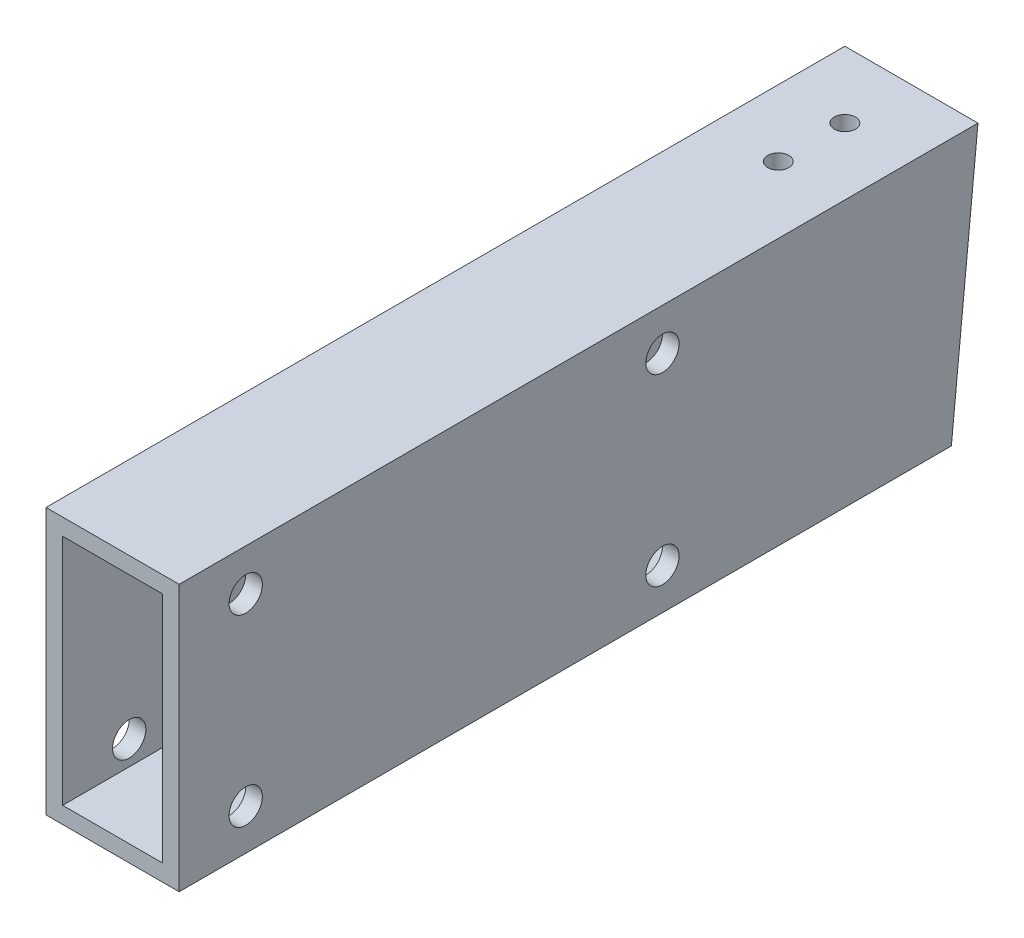
ISO-10303-21;
HEADER;
FILE_DESCRIPTION(('STEP AP214'),'2;1');
FILE_NAME('part.step','',(''),(''),'','','');
FILE_SCHEMA(('AUTOMOTIVE_DESIGN { 1 0 10303 214 1 1 1 1 }'));
ENDSEC;
DATA;
#1=APPLICATION_CONTEXT('core data for automotive mechanical design processes');
#2=APPLICATION_PROTOCOL_DEFINITION('international standard','automotive_design',2000,#1);
#3=PRODUCT_CONTEXT('',#1,'mechanical');
#4=PRODUCT('Part','Part','',(#3));
#5=PRODUCT_RELATED_PRODUCT_CATEGORY('part','',(#4));
#6=PRODUCT_DEFINITION_FORMATION('','',#4);
#7=PRODUCT_DEFINITION_CONTEXT('part definition',#1,'design');
#8=PRODUCT_DEFINITION('design','',#6,#7);
#9=PRODUCT_DEFINITION_SHAPE('','',#8);
#10=(LENGTH_UNIT() NAMED_UNIT(*) SI_UNIT(.MILLI.,.METRE.));
#11=(NAMED_UNIT(*) PLANE_ANGLE_UNIT() SI_UNIT($,.RADIAN.));
#12=(NAMED_UNIT(*) SI_UNIT($,.STERADIAN.) SOLID_ANGLE_UNIT());
#13=UNCERTAINTY_MEASURE_WITH_UNIT(LENGTH_MEASURE(1.E-05),#10,'distance_accuracy_value','');
#14=(GEOMETRIC_REPRESENTATION_CONTEXT(3) GLOBAL_UNCERTAINTY_ASSIGNED_CONTEXT((#13)) GLOBAL_UNIT_ASSIGNED_CONTEXT((#10,
#11,#12)) REPRESENTATION_CONTEXT('',''));
#15=CARTESIAN_POINT('',(0.,0.,0.));
#16=DIRECTION('',(0.,0.,1.));
#17=DIRECTION('',(1.,0.,0.));
#18=AXIS2_PLACEMENT_3D('',#15,#16,#17);
#19=CARTESIAN_POINT('',(12.7,-17.5895,63.4999999999996));
#20=DIRECTION('',(1.,0.,0.));
#21=DIRECTION('',(0.,0.,-1.));
#22=AXIS2_PLACEMENT_3D('',#19,#20,#21);
#23=CYLINDRICAL_SURFACE('',#22,3.175);
#24=CARTESIAN_POINT('',(-9.525,-17.5895,63.4999999999996));
#25=DIRECTION('',(-1.,0.,0.));
#26=DIRECTION('',(0.,-1.,0.));
#27=AXIS2_PLACEMENT_3D('',#24,#25,#26);
#28=CIRCLE('',#27,3.175);
#29=CARTESIAN_POINT('',(-9.525,-20.7645,63.4999999999996));
#30=VERTEX_POINT('',#29);
#31=EDGE_CURVE('E154',#30,#30,#28,.F.);
#32=ORIENTED_EDGE('',*,*,#31,.T.);
#33=EDGE_LOOP('',(#32));
#34=FACE_BOUND('',#33,.T.);
#35=CARTESIAN_POINT('',(-12.7,-17.5895,63.4999999999996));
#36=DIRECTION('',(1.,0.,0.));
#37=DIRECTION('',(0.,0.,-1.));
#38=AXIS2_PLACEMENT_3D('',#35,#36,#37);
#39=CIRCLE('',#38,3.17499999999999);
#40=CARTESIAN_POINT('',(-12.7,-17.5895,60.3249999999996));
#41=VERTEX_POINT('',#40);
#42=EDGE_CURVE('E192',#41,#41,#39,.T.);
#43=ORIENTED_EDGE('',*,*,#42,.F.);
#44=EDGE_LOOP('',(#43));
#45=FACE_BOUND('',#44,.T.);
#46=ADVANCED_FACE('F33',(#34,#45),#23,.F.);
#47=CARTESIAN_POINT('',(12.7,-17.5895,-16.0020000000004));
#48=DIRECTION('',(1.,0.,0.));
#49=DIRECTION('',(0.,0.,-1.));
#50=AXIS2_PLACEMENT_3D('',#47,#48,#49);
#51=CYLINDRICAL_SURFACE('',#50,3.175);
#52=CARTESIAN_POINT('',(-9.525,-17.5895,-16.0020000000004));
#53=DIRECTION('',(-1.,0.,0.));
#54=DIRECTION('',(0.,-1.,0.));
#55=AXIS2_PLACEMENT_3D('',#52,#53,#54);
#56=CIRCLE('',#55,3.175);
#57=CARTESIAN_POINT('',(-9.525,-20.7645,-16.0020000000004));
#58=VERTEX_POINT('',#57);
#59=EDGE_CURVE('E151',#58,#58,#56,.F.);
#60=ORIENTED_EDGE('',*,*,#59,.T.);
#61=EDGE_LOOP('',(#60));
#62=FACE_BOUND('',#61,.T.);
#63=CARTESIAN_POINT('',(-12.7,-17.5895,-16.0020000000004));
#64=DIRECTION('',(1.,0.,0.));
#65=DIRECTION('',(0.,0.,-1.));
#66=AXIS2_PLACEMENT_3D('',#63,#64,#65);
#67=CIRCLE('',#66,3.17499999999999);
#68=CARTESIAN_POINT('',(-12.7,-17.5895,-19.1770000000003));
#69=VERTEX_POINT('',#68);
#70=EDGE_CURVE('E186',#69,#69,#67,.T.);
#71=ORIENTED_EDGE('',*,*,#70,.F.);
#72=EDGE_LOOP('',(#71));
#73=FACE_BOUND('',#72,.T.);
#74=ADVANCED_FACE('F240',(#62,#73),#51,.F.);
#75=CARTESIAN_POINT('',(12.7,17.4625,-16.002));
#76=DIRECTION('',(1.,0.,0.));
#77=DIRECTION('',(0.,0.,-1.));
#78=AXIS2_PLACEMENT_3D('',#75,#76,#77);
#79=CYLINDRICAL_SURFACE('',#78,3.175);
#80=CARTESIAN_POINT('',(-9.52500000000001,17.4625,-16.002));
#81=DIRECTION('',(-1.,0.,0.));
#82=DIRECTION('',(0.,-1.,0.));
#83=AXIS2_PLACEMENT_3D('',#80,#81,#82);
#84=CIRCLE('',#83,3.175);
#85=CARTESIAN_POINT('',(-9.52500000000001,14.2875,-16.002));
#86=VERTEX_POINT('',#85);
#87=EDGE_CURVE('E148',#86,#86,#84,.F.);
#88=ORIENTED_EDGE('',*,*,#87,.T.);
#89=EDGE_LOOP('',(#88));
#90=FACE_BOUND('',#89,.T.);
#91=CARTESIAN_POINT('',(-12.7,17.4625,-16.002));
#92=DIRECTION('',(1.,0.,0.));
#93=DIRECTION('',(0.,0.,-1.));
#94=AXIS2_PLACEMENT_3D('',#91,#92,#93);
#95=CIRCLE('',#94,3.17499999999999);
#96=CARTESIAN_POINT('',(-12.7,17.4625,-19.177));
#97=VERTEX_POINT('',#96);
#98=EDGE_CURVE('E180',#97,#97,#95,.T.);
#99=ORIENTED_EDGE('',*,*,#98,.F.);
#100=EDGE_LOOP('',(#99));
#101=FACE_BOUND('',#100,.T.);
#102=ADVANCED_FACE('F308',(#90,#101),#79,.F.);
#103=CARTESIAN_POINT('',(12.7,17.4625,63.5));
#104=DIRECTION('',(1.,0.,0.));
#105=DIRECTION('',(0.,0.,-1.));
#106=AXIS2_PLACEMENT_3D('',#103,#104,#105);
#107=CYLINDRICAL_SURFACE('',#106,3.175);
#108=CARTESIAN_POINT('',(-9.52500000000001,17.4625,63.5));
#109=DIRECTION('',(-1.,0.,0.));
#110=DIRECTION('',(0.,-1.,0.));
#111=AXIS2_PLACEMENT_3D('',#108,#109,#110);
#112=CIRCLE('',#111,3.175);
#113=CARTESIAN_POINT('',(-9.52500000000001,14.2875,63.5));
#114=VERTEX_POINT('',#113);
#115=EDGE_CURVE('E145',#114,#114,#112,.F.);
#116=ORIENTED_EDGE('',*,*,#115,.T.);
#117=EDGE_LOOP('',(#116));
#118=FACE_BOUND('',#117,.T.);
#119=CARTESIAN_POINT('',(-12.7,17.4625,63.5));
#120=DIRECTION('',(1.,0.,0.));
#121=DIRECTION('',(0.,0.,-1.));
#122=AXIS2_PLACEMENT_3D('',#119,#120,#121);
#123=CIRCLE('',#122,3.17499999999999);
#124=CARTESIAN_POINT('',(-12.7,17.4625,60.325));
#125=VERTEX_POINT('',#124);
#126=EDGE_CURVE('E174',#125,#125,#123,.T.);
#127=ORIENTED_EDGE('',*,*,#126,.F.);
#128=EDGE_LOOP('',(#127));
#129=FACE_BOUND('',#128,.T.);
#130=ADVANCED_FACE('F248',(#118,#129),#107,.F.);
#131=CARTESIAN_POINT('',(-12.7,25.4,76.2));
#132=DIRECTION('',(1.,0.,0.));
#133=DIRECTION('',(0.,1.,0.));
#134=AXIS2_PLACEMENT_3D('',#131,#132,#133);
#135=PLANE('',#134);
#136=ORIENTED_EDGE('',*,*,#126,.T.);
#137=EDGE_LOOP('',(#136));
#138=FACE_BOUND('',#137,.T.);
#139=ORIENTED_EDGE('',*,*,#98,.T.);
#140=EDGE_LOOP('',(#139));
#141=FACE_BOUND('',#140,.T.);
#142=ORIENTED_EDGE('',*,*,#70,.T.);
#143=EDGE_LOOP('',(#142));
#144=FACE_BOUND('',#143,.T.);
#145=ORIENTED_EDGE('',*,*,#42,.T.);
#146=EDGE_LOOP('',(#145));
#147=FACE_BOUND('',#146,.T.);
#148=DIRECTION('',(0.,0.,-1.));
#149=VECTOR('',#148,1.);
#150=CARTESIAN_POINT('',(-12.7,25.4,76.2));
#151=LINE('',#150,#149);
#152=CARTESIAN_POINT('',(-12.7,25.4,76.2));
#153=VERTEX_POINT('',#152);
#154=CARTESIAN_POINT('',(-12.7,25.4,-76.2));
#155=VERTEX_POINT('',#154);
#156=EDGE_CURVE('E205',#153,#155,#151,.T.);
#157=ORIENTED_EDGE('',*,*,#156,.T.);
#158=DIRECTION('',(0.,-0.995037190209989,0.0995037190209989));
#159=VECTOR('',#158,1.);
#160=CARTESIAN_POINT('',(-12.7,25.4,-76.2));
#161=LINE('',#160,#159);
#162=CARTESIAN_POINT('',(-12.7,-25.4,-71.12));
#163=VERTEX_POINT('',#162);
#164=EDGE_CURVE('E158',#155,#163,#161,.T.);
#165=ORIENTED_EDGE('',*,*,#164,.T.);
#166=DIRECTION('',(0.,0.,-1.));
#167=VECTOR('',#166,1.);
#168=CARTESIAN_POINT('',(-12.7,-25.4,76.2));
#169=LINE('',#168,#167);
#170=CARTESIAN_POINT('',(-12.7,-25.4,76.2));
#171=VERTEX_POINT('',#170);
#172=EDGE_CURVE('E216',#171,#163,#169,.T.);
#173=ORIENTED_EDGE('',*,*,#172,.F.);
#174=DIRECTION('',(0.,-1.,0.));
#175=VECTOR('',#174,1.);
#176=CARTESIAN_POINT('',(-12.7,25.4,76.2));
#177=LINE('',#176,#175);
#178=EDGE_CURVE('E196',#153,#171,#177,.T.);
#179=ORIENTED_EDGE('',*,*,#178,.F.);
#180=EDGE_LOOP('',(#157,#165,#173,#179));
#181=FACE_BOUND('',#180,.T.);
#182=ADVANCED_FACE('F35',(#138,#141,#144,#147,#181),#135,.F.);
#183=CARTESIAN_POINT('',(12.7,-25.4,76.2));
#184=DIRECTION('',(0.,1.,0.));
#185=DIRECTION('',(-1.,0.,0.));
#186=AXIS2_PLACEMENT_3D('',#183,#184,#185);
#187=PLANE('',#186);
#188=ORIENTED_EDGE('',*,*,#172,.T.);
#189=DIRECTION('',(1.,0.,0.));
#190=VECTOR('',#189,1.);
#191=CARTESIAN_POINT('',(-12.7,-25.4,-71.12));
#192=LINE('',#191,#190);
#193=CARTESIAN_POINT('',(12.7,-25.4,-71.12));
#194=VERTEX_POINT('',#193);
#195=EDGE_CURVE('E161',#163,#194,#192,.T.);
#196=ORIENTED_EDGE('',*,*,#195,.T.);
#197=DIRECTION('',(0.,0.,-1.));
#198=VECTOR('',#197,1.);
#199=CARTESIAN_POINT('',(12.7,-25.4,76.2));
#200=LINE('',#199,#198);
#201=CARTESIAN_POINT('',(12.7,-25.4,76.2));
#202=VERTEX_POINT('',#201);
#203=EDGE_CURVE('E213',#202,#194,#200,.T.);
#204=ORIENTED_EDGE('',*,*,#203,.F.);
#205=DIRECTION('',(1.,0.,0.));
#206=VECTOR('',#205,1.);
#207=CARTESIAN_POINT('',(12.7,-25.4,76.2));
#208=LINE('',#207,#206);
#209=EDGE_CURVE('E199',#171,#202,#208,.T.);
#210=ORIENTED_EDGE('',*,*,#209,.F.);
#211=EDGE_LOOP('',(#188,#196,#204,#210));
#212=FACE_BOUND('',#211,.T.);
#213=ADVANCED_FACE('F247',(#212),#187,.F.);
#214=CARTESIAN_POINT('',(12.7,25.4,76.2));
#215=DIRECTION('',(-1.,0.,0.));
#216=DIRECTION('',(0.,-1.,0.));
#217=AXIS2_PLACEMENT_3D('',#214,#215,#216);
#218=PLANE('',#217);
#219=CARTESIAN_POINT('',(12.7,17.4625,63.5));
#220=DIRECTION('',(1.,0.,0.));
#221=DIRECTION('',(0.,0.,-1.));
#222=AXIS2_PLACEMENT_3D('',#219,#220,#221);
#223=CIRCLE('',#222,3.175);
#224=CARTESIAN_POINT('',(12.7,17.4625,60.325));
#225=VERTEX_POINT('',#224);
#226=EDGE_CURVE('E171',#225,#225,#223,.T.);
#227=ORIENTED_EDGE('',*,*,#226,.F.);
#228=EDGE_LOOP('',(#227));
#229=FACE_BOUND('',#228,.T.);
#230=CARTESIAN_POINT('',(12.7,17.4625,-16.002));
#231=DIRECTION('',(1.,0.,0.));
#232=DIRECTION('',(0.,0.,-1.));
#233=AXIS2_PLACEMENT_3D('',#230,#231,#232);
#234=CIRCLE('',#233,3.175);
#235=CARTESIAN_POINT('',(12.7,17.4625,-19.177));
#236=VERTEX_POINT('',#235);
#237=EDGE_CURVE('E177',#236,#236,#234,.T.);
#238=ORIENTED_EDGE('',*,*,#237,.F.);
#239=EDGE_LOOP('',(#238));
#240=FACE_BOUND('',#239,.T.);
#241=CARTESIAN_POINT('',(12.7,-17.5895,-16.0020000000004));
#242=DIRECTION('',(1.,0.,0.));
#243=DIRECTION('',(0.,0.,-1.));
#244=AXIS2_PLACEMENT_3D('',#241,#242,#243);
#245=CIRCLE('',#244,3.175);
#246=CARTESIAN_POINT('',(12.7,-17.5895,-19.1770000000003));
#247=VERTEX_POINT('',#246);
#248=EDGE_CURVE('E183',#247,#247,#245,.T.);
#249=ORIENTED_EDGE('',*,*,#248,.F.);
#250=EDGE_LOOP('',(#249));
#251=FACE_BOUND('',#250,.T.);
#252=CARTESIAN_POINT('',(12.7,-17.5895,63.4999999999996));
#253=DIRECTION('',(1.,0.,0.));
#254=DIRECTION('',(0.,0.,-1.));
#255=AXIS2_PLACEMENT_3D('',#252,#253,#254);
#256=CIRCLE('',#255,3.175);
#257=CARTESIAN_POINT('',(12.7,-17.5895,60.3249999999996));
#258=VERTEX_POINT('',#257);
#259=EDGE_CURVE('E189',#258,#258,#256,.T.);
#260=ORIENTED_EDGE('',*,*,#259,.F.);
#261=EDGE_LOOP('',(#260));
#262=FACE_BOUND('',#261,.T.);
#263=ORIENTED_EDGE('',*,*,#203,.T.);
#264=DIRECTION('',(0.,-0.995037190209989,0.0995037190209989));
#265=VECTOR('',#264,1.);
#266=CARTESIAN_POINT('',(12.7,25.4,-76.2));
#267=LINE('',#266,#265);
#268=CARTESIAN_POINT('',(12.7,25.4,-76.2));
#269=VERTEX_POINT('',#268);
#270=EDGE_CURVE('E157',#269,#194,#267,.T.);
#271=ORIENTED_EDGE('',*,*,#270,.F.);
#272=DIRECTION('',(0.,0.,-1.));
#273=VECTOR('',#272,1.);
#274=CARTESIAN_POINT('',(12.7,25.4,76.2));
#275=LINE('',#274,#273);
#276=CARTESIAN_POINT('',(12.7,25.4,76.2));
#277=VERTEX_POINT('',#276);
#278=EDGE_CURVE('E210',#277,#269,#275,.T.);
#279=ORIENTED_EDGE('',*,*,#278,.F.);
#280=DIRECTION('',(0.,1.,0.));
#281=VECTOR('',#280,1.);
#282=CARTESIAN_POINT('',(12.7,25.4,76.2));
#283=LINE('',#282,#281);
#284=EDGE_CURVE('E201',#202,#277,#283,.T.);
#285=ORIENTED_EDGE('',*,*,#284,.F.);
#286=EDGE_LOOP('',(#263,#271,#279,#285));
#287=FACE_BOUND('',#286,.T.);
#288=ADVANCED_FACE('F259',(#229,#240,#251,#262,#287),#218,.F.);
#289=CARTESIAN_POINT('',(12.7,25.4,76.2));
#290=DIRECTION('',(0.,-1.,0.));
#291=DIRECTION('',(1.,0.,0.));
#292=AXIS2_PLACEMENT_3D('',#289,#290,#291);
#293=PLANE('',#292);
#294=CARTESIAN_POINT('',(-1.40512601554121E-13,25.4,-63.5));
#295=DIRECTION('',(0.,1.,0.));
#296=DIRECTION('',(0.,0.,1.));
#297=AXIS2_PLACEMENT_3D('',#294,#295,#296);
#298=CIRCLE('',#297,2.01929999999999);
#299=CARTESIAN_POINT('',(-1.40512601554121E-13,25.4,-61.4807));
#300=VERTEX_POINT('',#299);
#301=EDGE_CURVE('E165',#300,#300,#298,.T.);
#302=ORIENTED_EDGE('',*,*,#301,.F.);
#303=EDGE_LOOP('',(#302));
#304=FACE_BOUND('',#303,.T.);
#305=CARTESIAN_POINT('',(0.,25.4,-50.8));
#306=DIRECTION('',(0.,1.,0.));
#307=DIRECTION('',(0.,0.,1.));
#308=AXIS2_PLACEMENT_3D('',#305,#306,#307);
#309=CIRCLE('',#308,2.01929999999999);
#310=CARTESIAN_POINT('',(0.,25.4,-48.7807));
#311=VERTEX_POINT('',#310);
#312=EDGE_CURVE('E168',#311,#311,#309,.T.);
#313=ORIENTED_EDGE('',*,*,#312,.F.);
#314=EDGE_LOOP('',(#313));
#315=FACE_BOUND('',#314,.T.);
#316=DIRECTION('',(-1.,0.,0.));
#317=VECTOR('',#316,1.);
#318=CARTESIAN_POINT('',(12.7,25.4,-76.2));
#319=LINE('',#318,#317);
#320=EDGE_CURVE('E195',#269,#155,#319,.T.);
#321=ORIENTED_EDGE('',*,*,#320,.T.);
#322=ORIENTED_EDGE('',*,*,#156,.F.);
#323=DIRECTION('',(-1.,0.,0.));
#324=VECTOR('',#323,1.);
#325=CARTESIAN_POINT('',(12.7,25.4,76.2));
#326=LINE('',#325,#324);
#327=EDGE_CURVE('E203',#277,#153,#326,.T.);
#328=ORIENTED_EDGE('',*,*,#327,.F.);
#329=ORIENTED_EDGE('',*,*,#278,.T.);
#330=EDGE_LOOP('',(#321,#322,#328,#329));
#331=FACE_BOUND('',#330,.T.);
#332=ADVANCED_FACE('F255',(#304,#315,#331),#293,.F.);
#333=CARTESIAN_POINT('',(0.,0.,76.2));
#334=DIRECTION('',(0.,0.,-1.));
#335=DIRECTION('',(-1.,0.,0.));
#336=AXIS2_PLACEMENT_3D('',#333,#334,#335);
#337=PLANE('',#336);
#338=DIRECTION('',(1.,0.,0.));
#339=VECTOR('',#338,1.);
#340=CARTESIAN_POINT('',(-9.525,-22.225,76.2));
#341=LINE('',#340,#339);
#342=CARTESIAN_POINT('',(-9.525,-22.225,76.2));
#343=VERTEX_POINT('',#342);
#344=CARTESIAN_POINT('',(9.525,-22.225,76.2));
#345=VERTEX_POINT('',#344);
#346=EDGE_CURVE('E111',#343,#345,#341,.T.);
#347=ORIENTED_EDGE('',*,*,#346,.F.);
#348=DIRECTION('',(0.,-1.,0.));
#349=VECTOR('',#348,1.);
#350=CARTESIAN_POINT('',(-9.52500000000001,22.225,76.2));
#351=LINE('',#350,#349);
#352=CARTESIAN_POINT('',(-9.52500000000001,22.225,76.2));
#353=VERTEX_POINT('',#352);
#354=EDGE_CURVE('E48',#353,#343,#351,.T.);
#355=ORIENTED_EDGE('',*,*,#354,.F.);
#356=DIRECTION('',(-1.,0.,0.));
#357=VECTOR('',#356,1.);
#358=CARTESIAN_POINT('',(9.52499999999999,22.225,76.2));
#359=LINE('',#358,#357);
#360=CARTESIAN_POINT('',(9.52499999999999,22.225,76.2));
#361=VERTEX_POINT('',#360);
#362=EDGE_CURVE('E118',#361,#353,#359,.T.);
#363=ORIENTED_EDGE('',*,*,#362,.F.);
#364=DIRECTION('',(0.,1.,0.));
#365=VECTOR('',#364,1.);
#366=CARTESIAN_POINT('',(9.525,-22.225,76.2));
#367=LINE('',#366,#365);
#368=EDGE_CURVE('E102',#345,#361,#367,.T.);
#369=ORIENTED_EDGE('',*,*,#368,.F.);
#370=EDGE_LOOP('',(#347,#355,#363,#369));
#371=FACE_BOUND('',#370,.T.);
#372=ORIENTED_EDGE('',*,*,#178,.T.);
#373=ORIENTED_EDGE('',*,*,#209,.T.);
#374=ORIENTED_EDGE('',*,*,#284,.T.);
#375=ORIENTED_EDGE('',*,*,#327,.T.);
#376=EDGE_LOOP('',(#372,#373,#374,#375));
#377=FACE_BOUND('',#376,.T.);
#378=ADVANCED_FACE('F115',(#371,#377),#337,.F.);
#379=CARTESIAN_POINT('',(9.525,-17.5895,63.4999999999996));
#380=DIRECTION('',(1.,0.,0.));
#381=DIRECTION('',(0.,1.,0.));
#382=AXIS2_PLACEMENT_3D('',#379,#380,#381);
#383=CIRCLE('',#382,3.175);
#384=CARTESIAN_POINT('',(9.525,-14.4145,63.4999999999996));
#385=VERTEX_POINT('',#384);
#386=EDGE_CURVE('E136',#385,#385,#383,.F.);
#387=ORIENTED_EDGE('',*,*,#386,.T.);
#388=EDGE_LOOP('',(#387));
#389=FACE_BOUND('',#388,.T.);
#390=ORIENTED_EDGE('',*,*,#259,.T.);
#391=EDGE_LOOP('',(#390));
#392=FACE_BOUND('',#391,.T.);
#393=ADVANCED_FACE('F242',(#389,#392),#23,.F.);
#394=CARTESIAN_POINT('',(9.525,-17.5895,-16.0020000000004));
#395=DIRECTION('',(1.,0.,0.));
#396=DIRECTION('',(0.,1.,0.));
#397=AXIS2_PLACEMENT_3D('',#394,#395,#396);
#398=CIRCLE('',#397,3.175);
#399=CARTESIAN_POINT('',(9.525,-14.4145,-16.0020000000004));
#400=VERTEX_POINT('',#399);
#401=EDGE_CURVE('E133',#400,#400,#398,.F.);
#402=ORIENTED_EDGE('',*,*,#401,.T.);
#403=EDGE_LOOP('',(#402));
#404=FACE_BOUND('',#403,.T.);
#405=ORIENTED_EDGE('',*,*,#248,.T.);
#406=EDGE_LOOP('',(#405));
#407=FACE_BOUND('',#406,.T.);
#408=ADVANCED_FACE('F269',(#404,#407),#51,.F.);
#409=CARTESIAN_POINT('',(9.52499999999999,17.4625,-16.002));
#410=DIRECTION('',(1.,0.,0.));
#411=DIRECTION('',(0.,1.,0.));
#412=AXIS2_PLACEMENT_3D('',#409,#410,#411);
#413=CIRCLE('',#412,3.175);
#414=CARTESIAN_POINT('',(9.52499999999999,20.6375,-16.002));
#415=VERTEX_POINT('',#414);
#416=EDGE_CURVE('E130',#415,#415,#413,.F.);
#417=ORIENTED_EDGE('',*,*,#416,.T.);
#418=EDGE_LOOP('',(#417));
#419=FACE_BOUND('',#418,.T.);
#420=ORIENTED_EDGE('',*,*,#237,.T.);
#421=EDGE_LOOP('',(#420));
#422=FACE_BOUND('',#421,.T.);
#423=ADVANCED_FACE('F319',(#419,#422),#79,.F.);
#424=CARTESIAN_POINT('',(9.52499999999999,17.4625,63.5));
#425=DIRECTION('',(1.,0.,0.));
#426=DIRECTION('',(0.,1.,0.));
#427=AXIS2_PLACEMENT_3D('',#424,#425,#426);
#428=CIRCLE('',#427,3.175);
#429=CARTESIAN_POINT('',(9.52499999999999,20.6375,63.5));
#430=VERTEX_POINT('',#429);
#431=EDGE_CURVE('E125',#430,#430,#428,.F.);
#432=ORIENTED_EDGE('',*,*,#431,.T.);
#433=EDGE_LOOP('',(#432));
#434=FACE_BOUND('',#433,.T.);
#435=ORIENTED_EDGE('',*,*,#226,.T.);
#436=EDGE_LOOP('',(#435));
#437=FACE_BOUND('',#436,.T.);
#438=ADVANCED_FACE('F327',(#434,#437),#107,.F.);
#439=CARTESIAN_POINT('',(0.,25.4,-50.8));
#440=DIRECTION('',(0.,1.,0.));
#441=DIRECTION('',(0.,0.,1.));
#442=AXIS2_PLACEMENT_3D('',#439,#440,#441);
#443=CYLINDRICAL_SURFACE('',#442,2.01929999999999);
#444=CARTESIAN_POINT('',(0.,22.225,-50.8));
#445=DIRECTION('',(0.,1.,0.));
#446=DIRECTION('',(-1.,0.,0.));
#447=AXIS2_PLACEMENT_3D('',#444,#445,#446);
#448=CIRCLE('',#447,2.01929999999999);
#449=CARTESIAN_POINT('',(-2.0193,22.225,-50.8));
#450=VERTEX_POINT('',#449);
#451=EDGE_CURVE('E142',#450,#450,#448,.F.);
#452=ORIENTED_EDGE('',*,*,#451,.T.);
#453=EDGE_LOOP('',(#452));
#454=FACE_BOUND('',#453,.T.);
#455=ORIENTED_EDGE('',*,*,#312,.T.);
#456=EDGE_LOOP('',(#455));
#457=FACE_BOUND('',#456,.T.);
#458=ADVANCED_FACE('F362',(#454,#457),#443,.F.);
#459=CARTESIAN_POINT('',(-1.40512601554121E-13,25.4,-63.5));
#460=DIRECTION('',(0.,1.,0.));
#461=DIRECTION('',(0.,0.,1.));
#462=AXIS2_PLACEMENT_3D('',#459,#460,#461);
#463=CYLINDRICAL_SURFACE('',#462,2.01929999999999);
#464=CARTESIAN_POINT('',(-1.40512601554121E-13,22.225,-63.5));
#465=DIRECTION('',(0.,1.,0.));
#466=DIRECTION('',(-1.,0.,0.));
#467=AXIS2_PLACEMENT_3D('',#464,#465,#466);
#468=CIRCLE('',#467,2.01929999999999);
#469=CARTESIAN_POINT('',(-2.01930000000013,22.225,-63.5));
#470=VERTEX_POINT('',#469);
#471=EDGE_CURVE('E139',#470,#470,#468,.F.);
#472=ORIENTED_EDGE('',*,*,#471,.T.);
#473=EDGE_LOOP('',(#472));
#474=FACE_BOUND('',#473,.T.);
#475=ORIENTED_EDGE('',*,*,#301,.T.);
#476=EDGE_LOOP('',(#475));
#477=FACE_BOUND('',#476,.T.);
#478=ADVANCED_FACE('F371',(#474,#477),#463,.F.);
#479=CARTESIAN_POINT('',(-12.7,25.4,-76.2));
#480=DIRECTION('',(0.,0.099503719020999,0.995037190209989));
#481=DIRECTION('',(0.,-0.995037190209989,0.099503719020999));
#482=AXIS2_PLACEMENT_3D('',#479,#480,#481);
#483=PLANE('',#482);
#484=DIRECTION('',(-1.,0.,0.));
#485=VECTOR('',#484,1.);
#486=CARTESIAN_POINT('',(-12.7,22.225,-75.8825));
#487=LINE('',#486,#485);
#488=CARTESIAN_POINT('',(9.52499999999999,22.225,-75.8825));
#489=VERTEX_POINT('',#488);
#490=CARTESIAN_POINT('',(-9.52500000000001,22.225,-75.8825));
#491=VERTEX_POINT('',#490);
#492=EDGE_CURVE('E41',#489,#491,#487,.T.);
#493=ORIENTED_EDGE('',*,*,#492,.T.);
#494=DIRECTION('',(0.,-0.995037190209989,0.0995037190209989));
#495=VECTOR('',#494,1.);
#496=CARTESIAN_POINT('',(-9.52500000000001,25.4,-76.2));
#497=LINE('',#496,#495);
#498=CARTESIAN_POINT('',(-9.525,-22.225,-71.4375));
#499=VERTEX_POINT('',#498);
#500=EDGE_CURVE('E11',#491,#499,#497,.T.);
#501=ORIENTED_EDGE('',*,*,#500,.T.);
#502=DIRECTION('',(1.,0.,0.));
#503=VECTOR('',#502,1.);
#504=CARTESIAN_POINT('',(-12.7,-22.225,-71.4375));
#505=LINE('',#504,#503);
#506=CARTESIAN_POINT('',(9.525,-22.225,-71.4375));
#507=VERTEX_POINT('',#506);
#508=EDGE_CURVE('E219',#499,#507,#505,.T.);
#509=ORIENTED_EDGE('',*,*,#508,.T.);
#510=DIRECTION('',(0.,0.995037190209989,-0.0995037190209989));
#511=VECTOR('',#510,1.);
#512=CARTESIAN_POINT('',(9.52499999999999,25.4,-76.2));
#513=LINE('',#512,#511);
#514=EDGE_CURVE('E105',#507,#489,#513,.T.);
#515=ORIENTED_EDGE('',*,*,#514,.T.);
#516=EDGE_LOOP('',(#493,#501,#509,#515));
#517=FACE_BOUND('',#516,.T.);
#518=ORIENTED_EDGE('',*,*,#270,.T.);
#519=ORIENTED_EDGE('',*,*,#195,.F.);
#520=ORIENTED_EDGE('',*,*,#164,.F.);
#521=ORIENTED_EDGE('',*,*,#320,.F.);
#522=EDGE_LOOP('',(#518,#519,#520,#521));
#523=FACE_BOUND('',#522,.T.);
#524=ADVANCED_FACE('F223',(#517,#523),#483,.F.);
#525=CARTESIAN_POINT('',(-9.52500000000001,22.225,-76.2));
#526=DIRECTION('',(-1.,0.,0.));
#527=DIRECTION('',(0.,-1.,0.));
#528=AXIS2_PLACEMENT_3D('',#525,#526,#527);
#529=PLANE('',#528);
#530=ORIENTED_EDGE('',*,*,#59,.F.);
#531=EDGE_LOOP('',(#530));
#532=FACE_BOUND('',#531,.T.);
#533=ORIENTED_EDGE('',*,*,#115,.F.);
#534=EDGE_LOOP('',(#533));
#535=FACE_BOUND('',#534,.T.);
#536=DIRECTION('',(0.,0.,1.));
#537=VECTOR('',#536,1.);
#538=CARTESIAN_POINT('',(-9.52500000000001,22.225,-76.2));
#539=LINE('',#538,#537);
#540=EDGE_CURVE('E123',#491,#353,#539,.T.);
#541=ORIENTED_EDGE('',*,*,#540,.T.);
#542=ORIENTED_EDGE('',*,*,#354,.T.);
#543=DIRECTION('',(0.,0.,1.));
#544=VECTOR('',#543,1.);
#545=CARTESIAN_POINT('',(-9.525,-22.225,-76.2));
#546=LINE('',#545,#544);
#547=EDGE_CURVE('E108',#499,#343,#546,.T.);
#548=ORIENTED_EDGE('',*,*,#547,.F.);
#549=ORIENTED_EDGE('',*,*,#500,.F.);
#550=EDGE_LOOP('',(#541,#542,#548,#549));
#551=FACE_BOUND('',#550,.T.);
#552=ORIENTED_EDGE('',*,*,#87,.F.);
#553=EDGE_LOOP('',(#552));
#554=FACE_BOUND('',#553,.T.);
#555=ORIENTED_EDGE('',*,*,#31,.F.);
#556=EDGE_LOOP('',(#555));
#557=FACE_BOUND('',#556,.T.);
#558=ADVANCED_FACE('F229',(#532,#535,#551,#554,#557),#529,.F.);
#559=CARTESIAN_POINT('',(9.52499999999999,22.225,-76.2));
#560=DIRECTION('',(0.,1.,0.));
#561=DIRECTION('',(-1.,0.,0.));
#562=AXIS2_PLACEMENT_3D('',#559,#560,#561);
#563=PLANE('',#562);
#564=ORIENTED_EDGE('',*,*,#471,.F.);
#565=EDGE_LOOP('',(#564));
#566=FACE_BOUND('',#565,.T.);
#567=DIRECTION('',(0.,0.,1.));
#568=VECTOR('',#567,1.);
#569=CARTESIAN_POINT('',(9.52499999999999,22.225,-76.2));
#570=LINE('',#569,#568);
#571=EDGE_CURVE('E107',#489,#361,#570,.T.);
#572=ORIENTED_EDGE('',*,*,#571,.T.);
#573=ORIENTED_EDGE('',*,*,#362,.T.);
#574=ORIENTED_EDGE('',*,*,#540,.F.);
#575=ORIENTED_EDGE('',*,*,#492,.F.);
#576=EDGE_LOOP('',(#572,#573,#574,#575));
#577=FACE_BOUND('',#576,.T.);
#578=ORIENTED_EDGE('',*,*,#451,.F.);
#579=EDGE_LOOP('',(#578));
#580=FACE_BOUND('',#579,.T.);
#581=ADVANCED_FACE('F227',(#566,#577,#580),#563,.F.);
#582=CARTESIAN_POINT('',(9.525,-22.225,-76.2));
#583=DIRECTION('',(1.,0.,0.));
#584=DIRECTION('',(0.,1.,0.));
#585=AXIS2_PLACEMENT_3D('',#582,#583,#584);
#586=PLANE('',#585);
#587=ORIENTED_EDGE('',*,*,#401,.F.);
#588=EDGE_LOOP('',(#587));
#589=FACE_BOUND('',#588,.T.);
#590=ORIENTED_EDGE('',*,*,#431,.F.);
#591=EDGE_LOOP('',(#590));
#592=FACE_BOUND('',#591,.T.);
#593=DIRECTION('',(0.,0.,1.));
#594=VECTOR('',#593,1.);
#595=CARTESIAN_POINT('',(9.525,-22.225,-76.2));
#596=LINE('',#595,#594);
#597=EDGE_CURVE('E56',#507,#345,#596,.T.);
#598=ORIENTED_EDGE('',*,*,#597,.T.);
#599=ORIENTED_EDGE('',*,*,#368,.T.);
#600=ORIENTED_EDGE('',*,*,#571,.F.);
#601=ORIENTED_EDGE('',*,*,#514,.F.);
#602=EDGE_LOOP('',(#598,#599,#600,#601));
#603=FACE_BOUND('',#602,.T.);
#604=ORIENTED_EDGE('',*,*,#416,.F.);
#605=EDGE_LOOP('',(#604));
#606=FACE_BOUND('',#605,.T.);
#607=ORIENTED_EDGE('',*,*,#386,.F.);
#608=EDGE_LOOP('',(#607));
#609=FACE_BOUND('',#608,.T.);
#610=ADVANCED_FACE('F98',(#589,#592,#603,#606,#609),#586,.F.);
#611=CARTESIAN_POINT('',(-9.525,-22.225,-76.2));
#612=DIRECTION('',(0.,-1.,0.));
#613=DIRECTION('',(1.,0.,0.));
#614=AXIS2_PLACEMENT_3D('',#611,#612,#613);
#615=PLANE('',#614);
#616=ORIENTED_EDGE('',*,*,#547,.T.);
#617=ORIENTED_EDGE('',*,*,#346,.T.);
#618=ORIENTED_EDGE('',*,*,#597,.F.);
#619=ORIENTED_EDGE('',*,*,#508,.F.);
#620=EDGE_LOOP('',(#616,#617,#618,#619));
#621=FACE_BOUND('',#620,.T.);
#622=ADVANCED_FACE('F112',(#621),#615,.F.);
#623=CLOSED_SHELL('',(#46,#74,#102,#130,#182,#213,#288,#332,#378,#393,#408,#423,#438,#458,#478,
#524,#558,#581,#610,#622));
#624=MANIFOLD_SOLID_BREP('B2',#623);
#625=ADVANCED_BREP_SHAPE_REPRESENTATION('',(#18,#624),#14);
#626=SHAPE_DEFINITION_REPRESENTATION(#9,#625);
ENDSEC;
END-ISO-10303-21;
